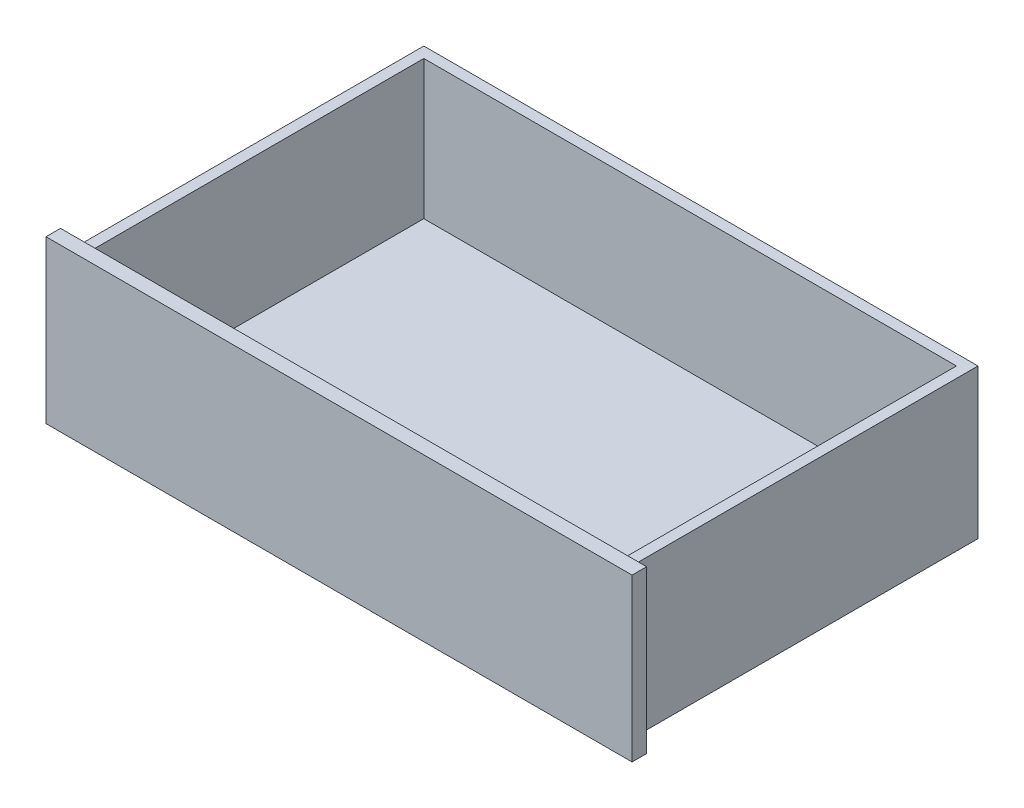
ISO-10303-21;
HEADER;
FILE_DESCRIPTION(('STEP AP214'),'2;1');
FILE_NAME('part.step','',(''),(''),'','','');
FILE_SCHEMA(('AUTOMOTIVE_DESIGN { 1 0 10303 214 1 1 1 1 }'));
ENDSEC;
DATA;
#1=APPLICATION_CONTEXT('core data for automotive mechanical design processes');
#2=APPLICATION_PROTOCOL_DEFINITION('international standard','automotive_design',2000,#1);
#3=PRODUCT_CONTEXT('',#1,'mechanical');
#4=PRODUCT('Part','Part','',(#3));
#5=PRODUCT_RELATED_PRODUCT_CATEGORY('part','',(#4));
#6=PRODUCT_DEFINITION_FORMATION('','',#4);
#7=PRODUCT_DEFINITION_CONTEXT('part definition',#1,'design');
#8=PRODUCT_DEFINITION('design','',#6,#7);
#9=PRODUCT_DEFINITION_SHAPE('','',#8);
#10=(LENGTH_UNIT() NAMED_UNIT(*) SI_UNIT(.MILLI.,.METRE.));
#11=(NAMED_UNIT(*) PLANE_ANGLE_UNIT() SI_UNIT($,.RADIAN.));
#12=(NAMED_UNIT(*) SI_UNIT($,.STERADIAN.) SOLID_ANGLE_UNIT());
#13=UNCERTAINTY_MEASURE_WITH_UNIT(LENGTH_MEASURE(1.E-05),#10,'distance_accuracy_value','');
#14=(GEOMETRIC_REPRESENTATION_CONTEXT(3) GLOBAL_UNCERTAINTY_ASSIGNED_CONTEXT((#13)) GLOBAL_UNIT_ASSIGNED_CONTEXT((#10,
#11,#12)) REPRESENTATION_CONTEXT('',''));
#15=CARTESIAN_POINT('',(0.,0.,0.));
#16=DIRECTION('',(0.,0.,1.));
#17=DIRECTION('',(1.,0.,0.));
#18=AXIS2_PLACEMENT_3D('',#15,#16,#17);
#19=CARTESIAN_POINT('',(0.,170.,0.));
#20=DIRECTION('',(0.,-1.,0.));
#21=DIRECTION('',(0.,0.,-1.));
#22=AXIS2_PLACEMENT_3D('',#19,#20,#21);
#23=PLANE('',#22);
#24=DIRECTION('',(0.,0.,-1.));
#25=VECTOR('',#24,1.);
#26=CARTESIAN_POINT('',(315.,170.,200.));
#27=LINE('',#26,#25);
#28=CARTESIAN_POINT('',(315.,170.,200.));
#29=VERTEX_POINT('',#28);
#30=CARTESIAN_POINT('',(315.,170.,-200.));
#31=VERTEX_POINT('',#30);
#32=EDGE_CURVE('E190',#29,#31,#27,.T.);
#33=ORIENTED_EDGE('',*,*,#32,.T.);
#34=DIRECTION('',(-1.,0.,0.));
#35=VECTOR('',#34,1.);
#36=CARTESIAN_POINT('',(-315.,170.,-200.));
#37=LINE('',#36,#35);
#38=CARTESIAN_POINT('',(-315.,170.,-200.));
#39=VERTEX_POINT('',#38);
#40=EDGE_CURVE('E81',#31,#39,#37,.T.);
#41=ORIENTED_EDGE('',*,*,#40,.T.);
#42=DIRECTION('',(0.,0.,1.));
#43=VECTOR('',#42,1.);
#44=CARTESIAN_POINT('',(-315.,170.,200.));
#45=LINE('',#44,#43);
#46=CARTESIAN_POINT('',(-315.,170.,200.));
#47=VERTEX_POINT('',#46);
#48=EDGE_CURVE('E194',#39,#47,#45,.T.);
#49=ORIENTED_EDGE('',*,*,#48,.T.);
#50=DIRECTION('',(1.,0.,0.));
#51=VECTOR('',#50,1.);
#52=CARTESIAN_POINT('',(-315.,170.,200.));
#53=LINE('',#52,#51);
#54=EDGE_CURVE('E56',#47,#29,#53,.T.);
#55=ORIENTED_EDGE('',*,*,#54,.T.);
#56=EDGE_LOOP('',(#33,#41,#49,#55));
#57=FACE_BOUND('',#56,.T.);
#58=DIRECTION('',(0.,0.,-1.));
#59=VECTOR('',#58,1.);
#60=CARTESIAN_POINT('',(302.7572,170.,0.));
#61=LINE('',#60,#59);
#62=CARTESIAN_POINT('',(302.7572,170.,187.7572));
#63=VERTEX_POINT('',#62);
#64=CARTESIAN_POINT('',(302.7572,170.,-187.7572));
#65=VERTEX_POINT('',#64);
#66=EDGE_CURVE('E183',#63,#65,#61,.T.);
#67=ORIENTED_EDGE('',*,*,#66,.F.);
#68=DIRECTION('',(1.,0.,0.));
#69=VECTOR('',#68,1.);
#70=CARTESIAN_POINT('',(0.,170.,187.7572));
#71=LINE('',#70,#69);
#72=CARTESIAN_POINT('',(-302.7572,170.,187.7572));
#73=VERTEX_POINT('',#72);
#74=EDGE_CURVE('E174',#73,#63,#71,.T.);
#75=ORIENTED_EDGE('',*,*,#74,.F.);
#76=DIRECTION('',(0.,0.,1.));
#77=VECTOR('',#76,1.);
#78=CARTESIAN_POINT('',(-302.7572,170.,0.));
#79=LINE('',#78,#77);
#80=CARTESIAN_POINT('',(-302.7572,170.,-187.7572));
#81=VERTEX_POINT('',#80);
#82=EDGE_CURVE('E187',#81,#73,#79,.T.);
#83=ORIENTED_EDGE('',*,*,#82,.F.);
#84=DIRECTION('',(-1.,0.,0.));
#85=VECTOR('',#84,1.);
#86=CARTESIAN_POINT('',(0.,170.,-187.7572));
#87=LINE('',#86,#85);
#88=EDGE_CURVE('E185',#65,#81,#87,.T.);
#89=ORIENTED_EDGE('',*,*,#88,.F.);
#90=EDGE_LOOP('',(#67,#75,#83,#89));
#91=FACE_BOUND('',#90,.T.);
#92=ADVANCED_FACE('F32',(#57,#91),#23,.F.);
#93=CARTESIAN_POINT('',(315.,170.,200.));
#94=DIRECTION('',(-1.,0.,0.));
#95=DIRECTION('',(0.,0.,1.));
#96=AXIS2_PLACEMENT_3D('',#93,#94,#95);
#97=PLANE('',#96);
#98=DIRECTION('',(0.,0.,-1.));
#99=VECTOR('',#98,1.);
#100=CARTESIAN_POINT('',(315.,0.,200.));
#101=LINE('',#100,#99);
#102=CARTESIAN_POINT('',(315.,0.,200.));
#103=VERTEX_POINT('',#102);
#104=CARTESIAN_POINT('',(315.,0.,-200.));
#105=VERTEX_POINT('',#104);
#106=EDGE_CURVE('E169',#103,#105,#101,.T.);
#107=ORIENTED_EDGE('',*,*,#106,.T.);
#108=DIRECTION('',(0.,-1.,0.));
#109=VECTOR('',#108,1.);
#110=CARTESIAN_POINT('',(315.,170.,-200.));
#111=LINE('',#110,#109);
#112=EDGE_CURVE('E11',#31,#105,#111,.T.);
#113=ORIENTED_EDGE('',*,*,#112,.F.);
#114=ORIENTED_EDGE('',*,*,#32,.F.);
#115=DIRECTION('',(0.,-1.,0.));
#116=VECTOR('',#115,1.);
#117=CARTESIAN_POINT('',(315.,170.,200.));
#118=LINE('',#117,#116);
#119=EDGE_CURVE('E74',#29,#103,#118,.T.);
#120=ORIENTED_EDGE('',*,*,#119,.T.);
#121=EDGE_LOOP('',(#107,#113,#114,#120));
#122=FACE_BOUND('',#121,.T.);
#123=ADVANCED_FACE('F34',(#122),#97,.F.);
#124=CARTESIAN_POINT('',(-315.,170.,-200.));
#125=DIRECTION('',(0.,0.,1.));
#126=DIRECTION('',(1.,0.,0.));
#127=AXIS2_PLACEMENT_3D('',#124,#125,#126);
#128=PLANE('',#127);
#129=DIRECTION('',(-1.,0.,0.));
#130=VECTOR('',#129,1.);
#131=CARTESIAN_POINT('',(-315.,0.,-200.));
#132=LINE('',#131,#130);
#133=CARTESIAN_POINT('',(-315.,0.,-200.));
#134=VERTEX_POINT('',#133);
#135=EDGE_CURVE('E198',#105,#134,#132,.T.);
#136=ORIENTED_EDGE('',*,*,#135,.T.);
#137=DIRECTION('',(0.,-1.,0.));
#138=VECTOR('',#137,1.);
#139=CARTESIAN_POINT('',(-315.,170.,-200.));
#140=LINE('',#139,#138);
#141=EDGE_CURVE('E40',#39,#134,#140,.T.);
#142=ORIENTED_EDGE('',*,*,#141,.F.);
#143=ORIENTED_EDGE('',*,*,#40,.F.);
#144=ORIENTED_EDGE('',*,*,#112,.T.);
#145=EDGE_LOOP('',(#136,#142,#143,#144));
#146=FACE_BOUND('',#145,.T.);
#147=ADVANCED_FACE('F246',(#146),#128,.F.);
#148=CARTESIAN_POINT('',(-315.,170.,200.));
#149=DIRECTION('',(1.,0.,0.));
#150=DIRECTION('',(0.,0.,-1.));
#151=AXIS2_PLACEMENT_3D('',#148,#149,#150);
#152=PLANE('',#151);
#153=DIRECTION('',(0.,0.,1.));
#154=VECTOR('',#153,1.);
#155=CARTESIAN_POINT('',(-315.,0.,200.));
#156=LINE('',#155,#154);
#157=CARTESIAN_POINT('',(-315.,0.,200.));
#158=VERTEX_POINT('',#157);
#159=EDGE_CURVE('E192',#134,#158,#156,.T.);
#160=ORIENTED_EDGE('',*,*,#159,.T.);
#161=DIRECTION('',(0.,-1.,0.));
#162=VECTOR('',#161,1.);
#163=CARTESIAN_POINT('',(-315.,170.,200.));
#164=LINE('',#163,#162);
#165=EDGE_CURVE('E202',#47,#158,#164,.T.);
#166=ORIENTED_EDGE('',*,*,#165,.F.);
#167=ORIENTED_EDGE('',*,*,#48,.F.);
#168=ORIENTED_EDGE('',*,*,#141,.T.);
#169=EDGE_LOOP('',(#160,#166,#167,#168));
#170=FACE_BOUND('',#169,.T.);
#171=ADVANCED_FACE('F208',(#170),#152,.F.);
#172=CARTESIAN_POINT('',(0.,0.,0.));
#173=DIRECTION('',(0.,-1.,0.));
#174=DIRECTION('',(0.,0.,-1.));
#175=AXIS2_PLACEMENT_3D('',#172,#173,#174);
#176=PLANE('',#175);
#177=ORIENTED_EDGE('',*,*,#106,.F.);
#178=DIRECTION('',(1.,0.,0.));
#179=VECTOR('',#178,1.);
#180=CARTESIAN_POINT('',(-328.,0.,200.));
#181=LINE('',#180,#179);
#182=CARTESIAN_POINT('',(338.2428,0.,200.));
#183=VERTEX_POINT('',#182);
#184=EDGE_CURVE('E213',#103,#183,#181,.T.);
#185=ORIENTED_EDGE('',*,*,#184,.T.);
#186=DIRECTION('',(0.,0.,-1.));
#187=VECTOR('',#186,1.);
#188=CARTESIAN_POINT('',(338.2428,0.,216.5));
#189=LINE('',#188,#187);
#190=CARTESIAN_POINT('',(338.2428,0.,216.5));
#191=VERTEX_POINT('',#190);
#192=EDGE_CURVE('E139',#191,#183,#189,.T.);
#193=ORIENTED_EDGE('',*,*,#192,.F.);
#194=DIRECTION('',(1.,0.,0.));
#195=VECTOR('',#194,1.);
#196=CARTESIAN_POINT('',(-328.,0.,216.5));
#197=LINE('',#196,#195);
#198=CARTESIAN_POINT('',(-328.,0.,216.5));
#199=VERTEX_POINT('',#198);
#200=EDGE_CURVE('E131',#199,#191,#197,.T.);
#201=ORIENTED_EDGE('',*,*,#200,.F.);
#202=DIRECTION('',(0.,0.,-1.));
#203=VECTOR('',#202,1.);
#204=CARTESIAN_POINT('',(-328.,0.,216.5));
#205=LINE('',#204,#203);
#206=CARTESIAN_POINT('',(-328.,0.,200.));
#207=VERTEX_POINT('',#206);
#208=EDGE_CURVE('E136',#199,#207,#205,.T.);
#209=ORIENTED_EDGE('',*,*,#208,.T.);
#210=EDGE_CURVE('E210',#207,#158,#181,.T.);
#211=ORIENTED_EDGE('',*,*,#210,.T.);
#212=ORIENTED_EDGE('',*,*,#159,.F.);
#213=ORIENTED_EDGE('',*,*,#135,.F.);
#214=EDGE_LOOP('',(#177,#185,#193,#201,#209,#211,#212,#213));
#215=FACE_BOUND('',#214,.T.);
#216=ADVANCED_FACE('F133',(#215),#176,.T.);
#217=CARTESIAN_POINT('',(302.7572,170.,200.));
#218=DIRECTION('',(-1.,0.,0.));
#219=DIRECTION('',(0.,0.,1.));
#220=AXIS2_PLACEMENT_3D('',#217,#218,#219);
#221=PLANE('',#220);
#222=DIRECTION('',(0.,0.,-1.));
#223=VECTOR('',#222,1.);
#224=CARTESIAN_POINT('',(302.7572,12.2428,0.));
#225=LINE('',#224,#223);
#226=CARTESIAN_POINT('',(302.7572,12.2428,187.7572));
#227=VERTEX_POINT('',#226);
#228=CARTESIAN_POINT('',(302.7572,12.2428,-187.7572));
#229=VERTEX_POINT('',#228);
#230=EDGE_CURVE('E157',#227,#229,#225,.T.);
#231=ORIENTED_EDGE('',*,*,#230,.F.);
#232=DIRECTION('',(0.,-1.,0.));
#233=VECTOR('',#232,1.);
#234=CARTESIAN_POINT('',(302.7572,170.,187.7572));
#235=LINE('',#234,#233);
#236=EDGE_CURVE('E171',#63,#227,#235,.T.);
#237=ORIENTED_EDGE('',*,*,#236,.F.);
#238=ORIENTED_EDGE('',*,*,#66,.T.);
#239=DIRECTION('',(0.,-1.,0.));
#240=VECTOR('',#239,1.);
#241=CARTESIAN_POINT('',(302.7572,170.,-187.7572));
#242=LINE('',#241,#240);
#243=EDGE_CURVE('E166',#65,#229,#242,.T.);
#244=ORIENTED_EDGE('',*,*,#243,.T.);
#245=EDGE_LOOP('',(#231,#237,#238,#244));
#246=FACE_BOUND('',#245,.T.);
#247=ADVANCED_FACE('F253',(#246),#221,.T.);
#248=CARTESIAN_POINT('',(-315.,170.,-187.7572));
#249=DIRECTION('',(0.,0.,1.));
#250=DIRECTION('',(1.,0.,0.));
#251=AXIS2_PLACEMENT_3D('',#248,#249,#250);
#252=PLANE('',#251);
#253=DIRECTION('',(-1.,0.,0.));
#254=VECTOR('',#253,1.);
#255=CARTESIAN_POINT('',(0.,12.2428,-187.7572));
#256=LINE('',#255,#254);
#257=CARTESIAN_POINT('',(-302.7572,12.2428,-187.7572));
#258=VERTEX_POINT('',#257);
#259=EDGE_CURVE('E160',#229,#258,#256,.T.);
#260=ORIENTED_EDGE('',*,*,#259,.F.);
#261=ORIENTED_EDGE('',*,*,#243,.F.);
#262=ORIENTED_EDGE('',*,*,#88,.T.);
#263=DIRECTION('',(0.,-1.,0.));
#264=VECTOR('',#263,1.);
#265=CARTESIAN_POINT('',(-302.7572,170.,-187.7572));
#266=LINE('',#265,#264);
#267=EDGE_CURVE('E170',#81,#258,#266,.T.);
#268=ORIENTED_EDGE('',*,*,#267,.T.);
#269=EDGE_LOOP('',(#260,#261,#262,#268));
#270=FACE_BOUND('',#269,.T.);
#271=ADVANCED_FACE('F276',(#270),#252,.T.);
#272=CARTESIAN_POINT('',(-302.7572,170.,200.));
#273=DIRECTION('',(1.,0.,0.));
#274=DIRECTION('',(0.,0.,-1.));
#275=AXIS2_PLACEMENT_3D('',#272,#273,#274);
#276=PLANE('',#275);
#277=DIRECTION('',(0.,0.,1.));
#278=VECTOR('',#277,1.);
#279=CARTESIAN_POINT('',(-302.7572,12.2428,0.));
#280=LINE('',#279,#278);
#281=CARTESIAN_POINT('',(-302.7572,12.2428,187.7572));
#282=VERTEX_POINT('',#281);
#283=EDGE_CURVE('E176',#258,#282,#280,.T.);
#284=ORIENTED_EDGE('',*,*,#283,.F.);
#285=ORIENTED_EDGE('',*,*,#267,.F.);
#286=ORIENTED_EDGE('',*,*,#82,.T.);
#287=DIRECTION('',(0.,-1.,0.));
#288=VECTOR('',#287,1.);
#289=CARTESIAN_POINT('',(-302.7572,170.,187.7572));
#290=LINE('',#289,#288);
#291=EDGE_CURVE('E47',#73,#282,#290,.T.);
#292=ORIENTED_EDGE('',*,*,#291,.T.);
#293=EDGE_LOOP('',(#284,#285,#286,#292));
#294=FACE_BOUND('',#293,.T.);
#295=ADVANCED_FACE('F284',(#294),#276,.T.);
#296=CARTESIAN_POINT('',(-315.,170.,187.7572));
#297=DIRECTION('',(0.,0.,-1.));
#298=DIRECTION('',(-1.,0.,0.));
#299=AXIS2_PLACEMENT_3D('',#296,#297,#298);
#300=PLANE('',#299);
#301=DIRECTION('',(1.,0.,0.));
#302=VECTOR('',#301,1.);
#303=CARTESIAN_POINT('',(0.,12.2428,187.7572));
#304=LINE('',#303,#302);
#305=EDGE_CURVE('E180',#282,#227,#304,.T.);
#306=ORIENTED_EDGE('',*,*,#305,.F.);
#307=ORIENTED_EDGE('',*,*,#291,.F.);
#308=ORIENTED_EDGE('',*,*,#74,.T.);
#309=ORIENTED_EDGE('',*,*,#236,.T.);
#310=EDGE_LOOP('',(#306,#307,#308,#309));
#311=FACE_BOUND('',#310,.T.);
#312=ADVANCED_FACE('F292',(#311),#300,.T.);
#313=CARTESIAN_POINT('',(0.,12.2428,0.));
#314=DIRECTION('',(0.,-1.,0.));
#315=DIRECTION('',(0.,0.,-1.));
#316=AXIS2_PLACEMENT_3D('',#313,#314,#315);
#317=PLANE('',#316);
#318=ORIENTED_EDGE('',*,*,#230,.T.);
#319=ORIENTED_EDGE('',*,*,#259,.T.);
#320=ORIENTED_EDGE('',*,*,#283,.T.);
#321=ORIENTED_EDGE('',*,*,#305,.T.);
#322=EDGE_LOOP('',(#318,#319,#320,#321));
#323=FACE_BOUND('',#322,.T.);
#324=ADVANCED_FACE('F239',(#323),#317,.F.);
#325=CARTESIAN_POINT('',(-328.,184.,216.5));
#326=DIRECTION('',(1.,0.,0.));
#327=DIRECTION('',(0.,1.,0.));
#328=AXIS2_PLACEMENT_3D('',#325,#326,#327);
#329=PLANE('',#328);
#330=DIRECTION('',(0.,-1.,0.));
#331=VECTOR('',#330,1.);
#332=CARTESIAN_POINT('',(-328.,184.,200.));
#333=LINE('',#332,#331);
#334=CARTESIAN_POINT('',(-328.,184.,200.));
#335=VERTEX_POINT('',#334);
#336=EDGE_CURVE('E156',#335,#207,#333,.T.);
#337=ORIENTED_EDGE('',*,*,#336,.T.);
#338=ORIENTED_EDGE('',*,*,#208,.F.);
#339=DIRECTION('',(0.,-1.,0.));
#340=VECTOR('',#339,1.);
#341=CARTESIAN_POINT('',(-328.,184.,216.5));
#342=LINE('',#341,#340);
#343=CARTESIAN_POINT('',(-328.,184.,216.5));
#344=VERTEX_POINT('',#343);
#345=EDGE_CURVE('E143',#344,#199,#342,.T.);
#346=ORIENTED_EDGE('',*,*,#345,.F.);
#347=DIRECTION('',(0.,0.,-1.));
#348=VECTOR('',#347,1.);
#349=CARTESIAN_POINT('',(-328.,184.,216.5));
#350=LINE('',#349,#348);
#351=EDGE_CURVE('E220',#344,#335,#350,.T.);
#352=ORIENTED_EDGE('',*,*,#351,.T.);
#353=EDGE_LOOP('',(#337,#338,#346,#352));
#354=FACE_BOUND('',#353,.T.);
#355=ADVANCED_FACE('F154',(#354),#329,.F.);
#356=CARTESIAN_POINT('',(338.2428,184.,216.5));
#357=DIRECTION('',(-1.,0.,0.));
#358=DIRECTION('',(0.,0.,1.));
#359=AXIS2_PLACEMENT_3D('',#356,#357,#358);
#360=PLANE('',#359);
#361=DIRECTION('',(0.,1.,0.));
#362=VECTOR('',#361,1.);
#363=CARTESIAN_POINT('',(338.2428,184.,200.));
#364=LINE('',#363,#362);
#365=CARTESIAN_POINT('',(338.2428,184.,200.));
#366=VERTEX_POINT('',#365);
#367=EDGE_CURVE('E212',#183,#366,#364,.T.);
#368=ORIENTED_EDGE('',*,*,#367,.T.);
#369=DIRECTION('',(0.,0.,-1.));
#370=VECTOR('',#369,1.);
#371=CARTESIAN_POINT('',(338.2428,184.,216.5));
#372=LINE('',#371,#370);
#373=CARTESIAN_POINT('',(338.2428,184.,216.5));
#374=VERTEX_POINT('',#373);
#375=EDGE_CURVE('E162',#374,#366,#372,.T.);
#376=ORIENTED_EDGE('',*,*,#375,.F.);
#377=DIRECTION('',(0.,1.,0.));
#378=VECTOR('',#377,1.);
#379=CARTESIAN_POINT('',(338.2428,184.,216.5));
#380=LINE('',#379,#378);
#381=EDGE_CURVE('E142',#191,#374,#380,.T.);
#382=ORIENTED_EDGE('',*,*,#381,.F.);
#383=ORIENTED_EDGE('',*,*,#192,.T.);
#384=EDGE_LOOP('',(#368,#376,#382,#383));
#385=FACE_BOUND('',#384,.T.);
#386=ADVANCED_FACE('F230',(#385),#360,.F.);
#387=CARTESIAN_POINT('',(-328.,184.,216.5));
#388=DIRECTION('',(0.,-1.,0.));
#389=DIRECTION('',(0.,0.,-1.));
#390=AXIS2_PLACEMENT_3D('',#387,#388,#389);
#391=PLANE('',#390);
#392=DIRECTION('',(-1.,0.,0.));
#393=VECTOR('',#392,1.);
#394=CARTESIAN_POINT('',(-328.,184.,200.));
#395=LINE('',#394,#393);
#396=EDGE_CURVE('E152',#366,#335,#395,.T.);
#397=ORIENTED_EDGE('',*,*,#396,.T.);
#398=ORIENTED_EDGE('',*,*,#351,.F.);
#399=DIRECTION('',(-1.,0.,0.));
#400=VECTOR('',#399,1.);
#401=CARTESIAN_POINT('',(-328.,184.,216.5));
#402=LINE('',#401,#400);
#403=EDGE_CURVE('E148',#374,#344,#402,.T.);
#404=ORIENTED_EDGE('',*,*,#403,.F.);
#405=ORIENTED_EDGE('',*,*,#375,.T.);
#406=EDGE_LOOP('',(#397,#398,#404,#405));
#407=FACE_BOUND('',#406,.T.);
#408=ADVANCED_FACE('F225',(#407),#391,.F.);
#409=CARTESIAN_POINT('',(0.,0.,216.5));
#410=DIRECTION('',(0.,0.,1.));
#411=DIRECTION('',(1.,0.,0.));
#412=AXIS2_PLACEMENT_3D('',#409,#410,#411);
#413=PLANE('',#412);
#414=ORIENTED_EDGE('',*,*,#345,.T.);
#415=ORIENTED_EDGE('',*,*,#200,.T.);
#416=ORIENTED_EDGE('',*,*,#381,.T.);
#417=ORIENTED_EDGE('',*,*,#403,.T.);
#418=EDGE_LOOP('',(#414,#415,#416,#417));
#419=FACE_BOUND('',#418,.T.);
#420=ADVANCED_FACE('F146',(#419),#413,.T.);
#421=CARTESIAN_POINT('',(0.,0.,200.));
#422=DIRECTION('',(0.,0.,1.));
#423=DIRECTION('',(1.,0.,0.));
#424=AXIS2_PLACEMENT_3D('',#421,#422,#423);
#425=PLANE('',#424);
#426=ORIENTED_EDGE('',*,*,#119,.F.);
#427=ORIENTED_EDGE('',*,*,#54,.F.);
#428=ORIENTED_EDGE('',*,*,#165,.T.);
#429=ORIENTED_EDGE('',*,*,#210,.F.);
#430=ORIENTED_EDGE('',*,*,#336,.F.);
#431=ORIENTED_EDGE('',*,*,#396,.F.);
#432=ORIENTED_EDGE('',*,*,#367,.F.);
#433=ORIENTED_EDGE('',*,*,#184,.F.);
#434=EDGE_LOOP('',(#426,#427,#428,#429,#430,#431,#432,#433));
#435=FACE_BOUND('',#434,.T.);
#436=ADVANCED_FACE('F228',(#435),#425,.F.);
#437=CLOSED_SHELL('',(#92,#123,#147,#171,#216,#247,#271,#295,#312,#324,#355,#386,#408,#420,#436));
#438=MANIFOLD_SOLID_BREP('B2',#437);
#439=ADVANCED_BREP_SHAPE_REPRESENTATION('',(#18,#438),#14);
#440=SHAPE_DEFINITION_REPRESENTATION(#9,#439);
ENDSEC;
END-ISO-10303-21;
